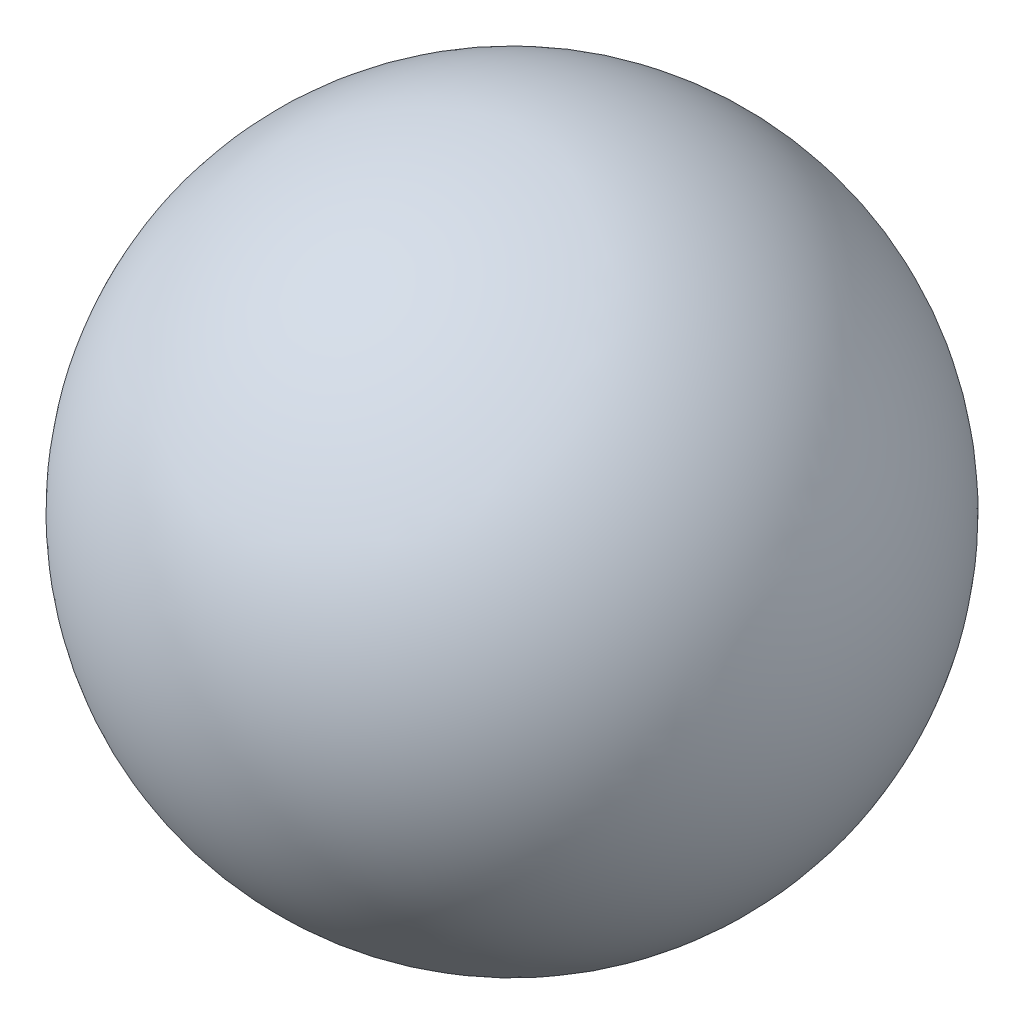
ISO-10303-21;
HEADER;
FILE_DESCRIPTION(('STEP AP214'),'2;1');
FILE_NAME('part.step','',(''),(''),'','','');
FILE_SCHEMA(('AUTOMOTIVE_DESIGN { 1 0 10303 214 1 1 1 1 }'));
ENDSEC;
DATA;
#1=APPLICATION_CONTEXT('core data for automotive mechanical design processes');
#2=APPLICATION_PROTOCOL_DEFINITION('international standard','automotive_design',2000,#1);
#3=PRODUCT_CONTEXT('',#1,'mechanical');
#4=PRODUCT('Part','Part','',(#3));
#5=PRODUCT_RELATED_PRODUCT_CATEGORY('part','',(#4));
#6=PRODUCT_DEFINITION_FORMATION('','',#4);
#7=PRODUCT_DEFINITION_CONTEXT('part definition',#1,'design');
#8=PRODUCT_DEFINITION('design','',#6,#7);
#9=PRODUCT_DEFINITION_SHAPE('','',#8);
#10=(LENGTH_UNIT() NAMED_UNIT(*) SI_UNIT(.MILLI.,.METRE.));
#11=(NAMED_UNIT(*) PLANE_ANGLE_UNIT() SI_UNIT($,.RADIAN.));
#12=(NAMED_UNIT(*) SI_UNIT($,.STERADIAN.) SOLID_ANGLE_UNIT());
#13=UNCERTAINTY_MEASURE_WITH_UNIT(LENGTH_MEASURE(1.E-05),#10,'distance_accuracy_value','');
#14=(GEOMETRIC_REPRESENTATION_CONTEXT(3) GLOBAL_UNCERTAINTY_ASSIGNED_CONTEXT((#13)) GLOBAL_UNIT_ASSIGNED_CONTEXT((#10,
#11,#12)) REPRESENTATION_CONTEXT('',''));
#15=CARTESIAN_POINT('',(0.,0.,0.));
#16=DIRECTION('',(0.,0.,1.));
#17=DIRECTION('',(1.,0.,0.));
#18=AXIS2_PLACEMENT_3D('',#15,#16,#17);
#19=CARTESIAN_POINT('',(0.,0.,0.));
#20=DIRECTION('',(-1.,0.,0.));
#21=DIRECTION('',(0.,0.,-1.));
#22=AXIS2_PLACEMENT_3D('',#19,#20,#21);
#23=SPHERICAL_SURFACE('',#22,21.);
#24=CARTESIAN_POINT('',(-21.,0.,0.));
#25=VERTEX_POINT('',#24);
#26=VERTEX_LOOP('',#25);
#27=FACE_BOUND('',#26,.T.);
#28=ADVANCED_FACE('F39',(#27),#23,.T.);
#29=CLOSED_SHELL('',(#28));
#30=MANIFOLD_SOLID_BREP('B2',#29);
#31=ADVANCED_BREP_SHAPE_REPRESENTATION('',(#18,#30),#14);
#32=SHAPE_DEFINITION_REPRESENTATION(#9,#31);
ENDSEC;
END-ISO-10303-21;
